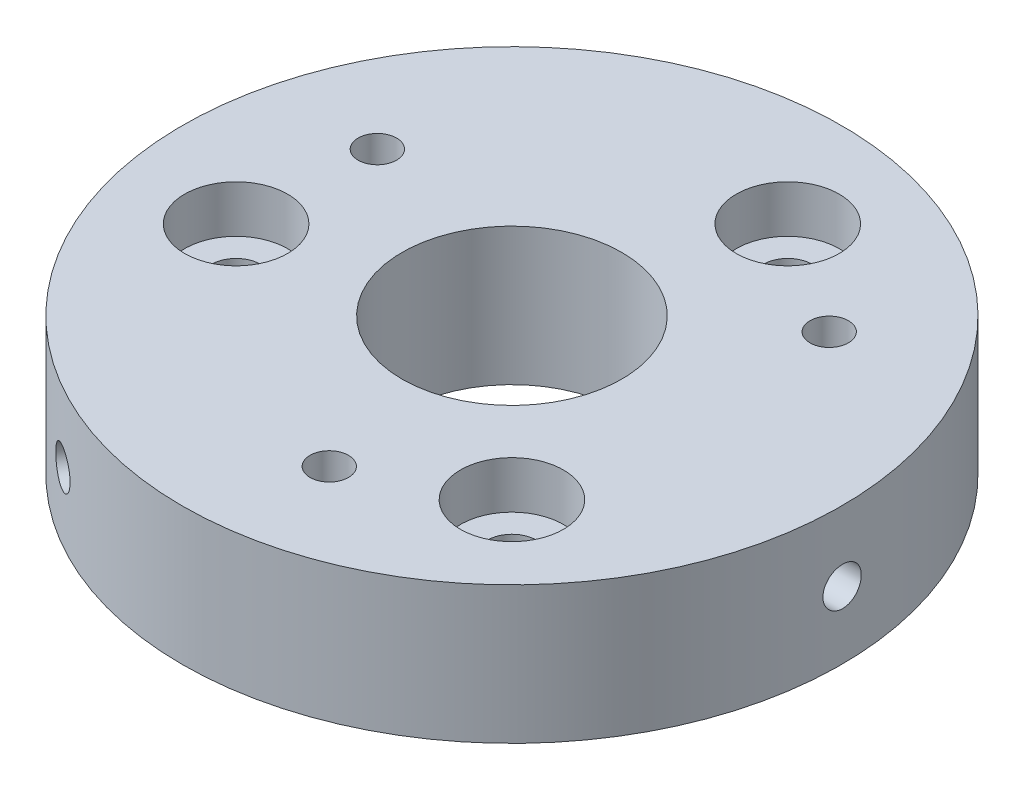
ISO-10303-21;
HEADER;
FILE_DESCRIPTION(('STEP AP214'),'2;1');
FILE_NAME('part.step','',(''),(''),'','','');
FILE_SCHEMA(('AUTOMOTIVE_DESIGN { 1 0 10303 214 1 1 1 1 }'));
ENDSEC;
DATA;
#1=APPLICATION_CONTEXT('core data for automotive mechanical design processes');
#2=APPLICATION_PROTOCOL_DEFINITION('international standard','automotive_design',2000,#1);
#3=PRODUCT_CONTEXT('',#1,'mechanical');
#4=PRODUCT('Part','Part','',(#3));
#5=PRODUCT_RELATED_PRODUCT_CATEGORY('part','',(#4));
#6=PRODUCT_DEFINITION_FORMATION('','',#4);
#7=PRODUCT_DEFINITION_CONTEXT('part definition',#1,'design');
#8=PRODUCT_DEFINITION('design','',#6,#7);
#9=PRODUCT_DEFINITION_SHAPE('','',#8);
#10=(LENGTH_UNIT() NAMED_UNIT(*) SI_UNIT(.MILLI.,.METRE.));
#11=(NAMED_UNIT(*) PLANE_ANGLE_UNIT() SI_UNIT($,.RADIAN.));
#12=(NAMED_UNIT(*) SI_UNIT($,.STERADIAN.) SOLID_ANGLE_UNIT());
#13=UNCERTAINTY_MEASURE_WITH_UNIT(LENGTH_MEASURE(1.E-05),#10,'distance_accuracy_value','');
#14=(GEOMETRIC_REPRESENTATION_CONTEXT(3) GLOBAL_UNCERTAINTY_ASSIGNED_CONTEXT((#13)) GLOBAL_UNIT_ASSIGNED_CONTEXT((#10,
#11,#12)) REPRESENTATION_CONTEXT('',''));
#15=CARTESIAN_POINT('',(0.,0.,0.));
#16=DIRECTION('',(0.,0.,1.));
#17=DIRECTION('',(1.,0.,0.));
#18=AXIS2_PLACEMENT_3D('',#15,#16,#17);
#19=CARTESIAN_POINT('',(0.,6.35,0.));
#20=DIRECTION('',(0.,-1.,0.));
#21=DIRECTION('',(0.,0.,-1.));
#22=AXIS2_PLACEMENT_3D('',#19,#20,#21);
#23=CYLINDRICAL_SURFACE('',#22,15.24);
#24=CARTESIAN_POINT('',(15.210835388447,3.10562907168175,-0.942383566053044));
#25=CARTESIAN_POINT('',(15.2108357438498,3.05573915086422,-0.942381369620589));
#26=CARTESIAN_POINT('',(15.2110982109886,3.00581413672508,-0.938170682637961));
#27=CARTESIAN_POINT('',(15.2121210827097,2.90734219854528,-0.921433529301182));
#28=CARTESIAN_POINT('',(15.2128820694043,2.85879695486656,-0.908897341170696));
#29=CARTESIAN_POINT('',(15.2148192242805,2.76452521959977,-0.875869866024178));
#30=CARTESIAN_POINT('',(15.2159951759658,2.71879727275178,-0.855382726635417));
#31=CARTESIAN_POINT('',(15.218635539739,2.63144212531057,-0.80704116645278));
#32=CARTESIAN_POINT('',(15.2200998850259,2.58981397841832,-0.779188451246291));
#33=CARTESIAN_POINT('',(15.2231624779154,2.51177273214568,-0.716865256237757));
#34=CARTESIAN_POINT('',(15.2247608799361,2.47536578145165,-0.682387083994958));
#35=CARTESIAN_POINT('',(15.2279204355405,2.40885294748971,-0.607806971227045));
#36=CARTESIAN_POINT('',(15.2294815875802,2.3787473250187,-0.567704798052651));
#37=CARTESIAN_POINT('',(15.2324037747559,2.32567350754106,-0.482980772871211));
#38=CARTESIAN_POINT('',(15.2337646698066,2.30271029645941,-0.43835579354192));
#39=CARTESIAN_POINT('',(15.2361447960645,2.26460507806796,-0.345874492886326));
#40=CARTESIAN_POINT('',(15.2371640305449,2.24946299582965,-0.298018202521815));
#41=CARTESIAN_POINT('',(15.2387590690844,2.22744663982234,-0.200490805976969));
#42=CARTESIAN_POINT('',(15.2393353814101,2.2205628842693,-0.150821848682169));
#43=CARTESIAN_POINT('',(15.239996234454,2.21522931167119,-0.0510302016138134));
#44=CARTESIAN_POINT('',(15.2400807801167,2.21677940982817,-0.000907516407309841));
#45=CARTESIAN_POINT('',(15.2397636063129,2.22826170570507,0.0983045430631114));
#46=CARTESIAN_POINT('',(15.2393624784043,2.23818370186702,0.147395100439779));
#47=CARTESIAN_POINT('',(15.2381345375052,2.26611231970426,0.243214225545538));
#48=CARTESIAN_POINT('',(15.2373077222587,2.28411898422623,0.289942780755159));
#49=CARTESIAN_POINT('',(15.2353344292366,2.32771737622591,0.379743944927557));
#50=CARTESIAN_POINT('',(15.2341877562736,2.35331373578005,0.422814300538954));
#51=CARTESIAN_POINT('',(15.2317164627169,2.41136155707889,0.504051450559688));
#52=CARTESIAN_POINT('',(15.2303918403876,2.4438130856838,0.542218197137036));
#53=CARTESIAN_POINT('',(15.2277226765829,2.51470770138043,0.612623819228835));
#54=CARTESIAN_POINT('',(15.2263781083747,2.55315964163348,0.644853779751722));
#55=CARTESIAN_POINT('',(15.2238321116513,2.63493252419421,0.702401785716356));
#56=CARTESIAN_POINT('',(15.2226306831856,2.6782534681861,0.72771982876722));
#57=CARTESIAN_POINT('',(15.2205141175537,2.76854020036475,0.770724244745043));
#58=CARTESIAN_POINT('',(15.2195989939358,2.81550616090513,0.788410256533745));
#59=CARTESIAN_POINT('',(15.2181639944575,2.91174719746249,0.815642194629128));
#60=CARTESIAN_POINT('',(15.2176441145492,2.96102224982481,0.825188204303878));
#61=CARTESIAN_POINT('',(15.2170618275163,3.06040500548103,0.835857917344753));
#62=CARTESIAN_POINT('',(15.2169987475114,3.11051137504306,0.836994008833187));
#63=CARTESIAN_POINT('',(15.217335752887,3.2102027541407,0.830843969487238));
#64=CARTESIAN_POINT('',(15.2177358361725,3.25978776603366,0.823557876750799));
#65=CARTESIAN_POINT('',(15.2189513057079,3.35699395244725,0.800780705347454));
#66=CARTESIAN_POINT('',(15.2197664038005,3.404616464825,0.785295319403622));
#67=CARTESIAN_POINT('',(15.2217152205649,3.49658708907552,0.74656515616023));
#68=CARTESIAN_POINT('',(15.2228489417532,3.54093517508458,0.723320317579108));
#69=CARTESIAN_POINT('',(15.2253019892694,3.62515499226714,0.669699738366178));
#70=CARTESIAN_POINT('',(15.2266215310992,3.66502142800395,0.639315690426118));
#71=CARTESIAN_POINT('',(15.2292877066394,3.73909296617015,0.572291714858236));
#72=CARTESIAN_POINT('',(15.230634340582,3.77329802006102,0.535651733599909));
#73=CARTESIAN_POINT('',(15.233194010107,3.8351175981552,0.457103127823221));
#74=CARTESIAN_POINT('',(15.2344068823706,3.86272411269336,0.415188193500145));
#75=CARTESIAN_POINT('',(15.2365480406411,3.91050817473892,0.327311692466773));
#76=CARTESIAN_POINT('',(15.2374763282192,3.93068576326262,0.281350148100203));
#77=CARTESIAN_POINT('',(15.2389295461299,3.96302524671264,0.18671500249684));
#78=CARTESIAN_POINT('',(15.2394547325733,3.97519223048589,0.138043144382286));
#79=CARTESIAN_POINT('',(15.2400290801221,3.99118178618579,0.0393448816022933));
#80=CARTESIAN_POINT('',(15.2400782451954,3.99500442766604,-0.0106815117690063));
#81=CARTESIAN_POINT('',(15.2396805035322,3.99419612411649,-0.110589360620635));
#82=CARTESIAN_POINT('',(15.2392343333453,3.98957772408495,-0.160470921014342));
#83=CARTESIAN_POINT('',(15.2378825899182,3.972044420156,-0.258747453865072));
#84=CARTESIAN_POINT('',(15.2369770158476,3.95912950126334,-0.307142423635046));
#85=CARTESIAN_POINT('',(15.2347940023359,3.92537251410569,-0.401074361952386));
#86=CARTESIAN_POINT('',(15.2335165633654,3.90453045587527,-0.446611334117463));
#87=CARTESIAN_POINT('',(15.2307198967076,3.85551268342642,-0.533540136784626));
#88=CARTESIAN_POINT('',(15.229200675703,3.82733717189063,-0.574932081803568));
#89=CARTESIAN_POINT('',(15.2260765288621,3.76440631906643,-0.652459625784385));
#90=CARTESIAN_POINT('',(15.2244714882328,3.72964199804947,-0.688587930797185));
#91=CARTESIAN_POINT('',(15.2213471776756,3.65453073739528,-0.754507964995057));
#92=CARTESIAN_POINT('',(15.2198279288746,3.61418243102959,-0.784298138324674));
#93=CARTESIAN_POINT('',(15.2170364576637,3.52900759887626,-0.836715841147342));
#94=CARTESIAN_POINT('',(15.2157645187489,3.48417602192189,-0.859335169093836));
#95=CARTESIAN_POINT('',(15.213608502177,3.39137672649247,-0.896699445040264));
#96=CARTESIAN_POINT('',(15.2127239690795,3.34341276717147,-0.911453643865012));
#97=CARTESIAN_POINT('',(15.2116709389508,3.26356627384235,-0.928821675839144));
#98=CARTESIAN_POINT('',(15.2113589446927,3.23220025640127,-0.933900841434112));
#99=CARTESIAN_POINT('',(15.2109410564941,3.16910391894995,-0.940682483307767));
#100=CARTESIAN_POINT('',(15.2108351623074,3.13737359937537,-0.942384963624132));
#101=CARTESIAN_POINT('',(15.210835388447,3.10562907168175,-0.942383566053044));
#102=B_SPLINE_CURVE_WITH_KNOTS('',3,(#24,#25,#26,#27,#28,#29,#30,#31,#32,#33,#34,#35,#36,#37,
#38,#39,#40,#41,#42,#43,#44,#45,#46,#47,#48,#49,#50,#51,#52,#53,#54,#55,#56,#57,#58,#59,#60,#61,
#62,#63,#64,#65,#66,#67,#68,#69,#70,#71,#72,#73,#74,#75,#76,#77,#78,#79,#80,#81,#82,#83,#84,#85,
#86,#87,#88,#89,#90,#91,#92,#93,#94,#95,#96,#97,#98,#99,#100,#101),.UNSPECIFIED.,.T.,.F.,(4,2,2,
2,2,2,2,2,2,2,2,2,2,2,2,2,2,2,2,2,2,2,2,2,2,2,2,2,2,2,2,2,2,2,2,2,2,2,4),(0.,0.149553877868915,
0.299282699176664,0.44893351894824,0.598549715576457,0.748340684221818,0.89813785113181,
1.04803931216985,1.19793933708509,1.34766708931575,1.49739333611597,1.64693739737364,
1.796482251186,1.94611856242724,2.09575633317692,2.24561700797405,2.39547773460904,
2.54534555169046,2.69521183384101,2.84485731337193,2.99450211598076,3.14404315702108,
3.2935853791145,3.4433024805025,3.59302086544113,3.7429200740914,3.89281845511146,
4.04262151900494,4.19242333422227,4.34200269636872,4.49158232886762,4.64116177202189,
4.79073708152506,4.94051772887057,5.09033510136817,5.24032321215622,5.39013451817013,
5.48529447867452,5.5804543253911),.UNSPECIFIED.);
#103=CARTESIAN_POINT('',(15.210835388447,3.10562907168175,-0.942383566053044));
#104=VERTEX_POINT('',#103);
#105=EDGE_CURVE('E11',#104,#104,#102,.T.);
#106=ORIENTED_EDGE('',*,*,#105,.T.);
#107=EDGE_LOOP('',(#106));
#108=FACE_BOUND('',#107,.T.);
#109=CARTESIAN_POINT('',(-8.42154580253449,3.10562907168175,-12.7017780761519));
#110=CARTESIAN_POINT('',(-8.42154407806955,3.05573915086422,-12.7017794821559));
#111=CARTESIAN_POINT('',(-8.41802874974463,3.00581413672508,-12.7041121288572));
#112=CARTESIAN_POINT('',(-8.40404538562846,2.90734219854528,-12.7133665384208));
#113=CARTESIAN_POINT('',(-8.39356922158816,2.85879695486656,-12.7202936662955));
#114=CARTESIAN_POINT('',(-8.36593516652651,2.76452521959977,-12.7384850292026));
#115=CARTESIAN_POINT('',(-8.34878075920765,2.71879727275178,-12.7497470029301));
#116=CARTESIAN_POINT('',(-8.30823592191751,2.63144212531057,-12.7762044051243));
#117=CARTESIAN_POINT('',(-8.28484693562772,2.58981397841832,-12.7913989229458));
#118=CARTESIAN_POINT('',(-8.23240476195011,2.51177273214568,-12.8252128036939));
#119=CARTESIAN_POINT('',(-8.20334498992213,2.47536578145165,-12.8438361465707));
#120=CARTESIAN_POINT('',(-8.14033649545022,2.40885294748971,-12.8838624583727));
#121=CARTESIAN_POINT('',(-8.10638757075408,2.3787473250187,-12.9052655422855));
#122=CARTESIAN_POINT('',(-8.03447550622392,2.32567350754106,-12.9501582432049));
#123=CARTESIAN_POINT('',(-7.99650958800675,2.30271029645941,-12.9736493025554));
#124=CARTESIAN_POINT('',(-7.91760849539293,2.26460507806796,-13.0219512026867));
#125=CARTESIAN_POINT('',(-7.87667334944655,2.24946299582965,-13.0467620308214));
#126=CARTESIAN_POINT('',(-7.79300966574353,2.22744663982234,-13.0969070729891));
#127=CARTESIAN_POINT('',(-7.75028324310958,2.2205628842693,-13.122240652751));
#128=CARTESIAN_POINT('',(-7.66419156818487,2.21522931167119,-13.1727087918094));
#129=CARTESIAN_POINT('',(-7.6208263223215,2.21677940982817,-13.1978433531044));
#130=CARTESIAN_POINT('',(-7.53474757155645,2.22826170570507,-13.2471747022681));
#131=CARTESIAN_POINT('',(-7.49203333782798,2.23818370186702,-13.2713725939973));
#132=CARTESIAN_POINT('',(-7.40843757086845,2.26611231970426,-13.3182187285372));
#133=CARTESIAN_POINT('',(-7.36755604735154,2.28411898422623,-13.3408669631344));
#134=CARTESIAN_POINT('',(-7.28879931137779,2.32771737622591,-13.3840586233344));
#135=CARTESIAN_POINT('',(-7.2509259527868,2.35331373578005,-13.4046007532243));
#136=CARTESIAN_POINT('',(-7.17933687035942,2.41136155707889,-13.4430791252343));
#137=CARTESIAN_POINT('',(-7.14562118707898,2.4438130856838,-13.4610153419354));
#138=CARTESIAN_POINT('',(-7.08331354787587,2.51470770138043,-13.4939065893195));
#139=CARTESIAN_POINT('',(-7.05472929919601,2.55315964163348,-13.5088571393556));
#140=CARTESIAN_POINT('',(-7.0036182657318,2.63493252419421,-13.5354262444975));
#141=CARTESIAN_POINT('',(-6.98109148304278,2.6782534681861,-13.5470447984508));
#142=CARTESIAN_POINT('',(-6.94279028351515,2.76854020036475,-13.5667140068337));
#143=CARTESIAN_POINT('',(-6.92701618620553,2.81550616090513,-13.5747644924273));
#144=CARTESIAN_POINT('',(-6.90271513628151,2.91174719746249,-13.5871377154724));
#145=CARTESIAN_POINT('',(-6.89418810944425,2.96102224982481,-13.5914604911023));
#146=CARTESIAN_POINT('',(-6.88465672338329,3.06040500548103,-13.5962910722599));
#147=CARTESIAN_POINT('',(-6.88364129929084,3.11051137504306,-13.5968044891174));
#148=CARTESIAN_POINT('',(-6.88913589228653,3.2102027541407,-13.594021324661));
#149=CARTESIAN_POINT('',(-6.89564587533332,3.25978776603366,-13.5907247605815));
#150=CARTESIAN_POINT('',(-6.91597921916271,3.35699395244725,-13.5803888023751));
#151=CARTESIAN_POINT('',(-6.92979750582375,3.404616464825,-13.5733520050579));
#152=CARTESIAN_POINT('',(-6.96431321946747,3.49658708907552,-13.5556746482616));
#153=CARTESIAN_POINT('',(-6.98501070077973,3.54093517508458,-13.5450340603209));
#154=CARTESIAN_POINT('',(-7.03267400830185,3.62515499226714,-13.5203481721801));
#155=CARTESIAN_POINT('',(-7.05964713660267,3.66502142800395,-13.5062989049561));
#156=CARTESIAN_POINT('',(-7.11902468987719,3.73909296617015,-13.4750958929209));
#157=CARTESIAN_POINT('',(-7.15142916141235,3.77329802006102,-13.4579421214956));
#158=CARTESIAN_POINT('',(-7.22073408420934,3.8351175981552,-13.4208845574412));
#159=CARTESIAN_POINT('',(-7.25763991826289,3.86272411269336,-13.4009774684715));
#160=CARTESIAN_POINT('',(-7.33481377968872,3.91050817473892,-13.3588935154106));
#161=CARTESIAN_POINT('',(-7.37508178849637,3.93068576326262,-13.3367166638519));
#162=CARTESIAN_POINT('',(-7.45776483763507,3.96302524671264,-13.2906576146781));
#163=CARTESIAN_POINT('',(-7.50017849643336,3.97519223048589,-13.2667765104226));
#164=CARTESIAN_POINT('',(-7.58594087308463,3.99118178618579,-13.2179247786004));
#165=CARTESIAN_POINT('',(-7.62928958314053,3.99500442766604,-13.1929541601172));
#166=CARTESIAN_POINT('',(-7.71561344745192,3.99419612411649,-13.142655781307));
#167=CARTESIAN_POINT('',(-7.75858906083982,3.98957772408495,-13.1173286063938));
#168=CARTESIAN_POINT('',(-7.84302316317084,3.972044420156,-13.0670196958212));
#169=CARTESIAN_POINT('',(-7.88448164937174,3.95912950126334,-13.0420379607861));
#170=CARTESIAN_POINT('',(-7.9647375874254,3.92537251410569,-12.9931814464694));
#171=CARTESIAN_POINT('',(-8.00353504264657,3.90453045587527,-12.9693066657867));
#172=CARTESIAN_POINT('',(-8.07741926074796,3.85551268342642,-12.9234202800815));
#173=CARTESIAN_POINT('',(-8.11250612614412,3.82733717189063,-12.9014086235881));
#174=CARTESIAN_POINT('',(-8.17808487530407,3.76440631906643,-12.8599392610683));
#175=CARTESIAN_POINT('',(-8.20857038492618,3.72964199804947,-12.8404851026028));
#176=CARTESIAN_POINT('',(-8.26409665388128,3.65453073739528,-12.8048193531921));
#177=CARTESIAN_POINT('',(-8.28913607636735,3.61418243102959,-12.7886085584709));
#178=CARTESIAN_POINT('',(-8.33313540301438,3.52900759887626,-12.759982222077));
#179=CARTESIAN_POINT('',(-8.35208834617518,3.48417602192189,-12.7475710266915));
#180=CARTESIAN_POINT('',(-8.38336875005283,3.39137672649247,-12.727021723596));
#181=CARTESIAN_POINT('',(-8.39570399449882,3.34341276717147,-12.7188785960508));
#182=CARTESIAN_POINT('',(-8.41021863633781,3.26356627384234,-12.7092826292213));
#183=CARTESIAN_POINT('',(-8.414461325644,3.23220025640127,-12.7064728514704));
#184=CARTESIAN_POINT('',(-8.42012545568669,3.16910391894995,-12.7027201287377));
#185=CARTESIAN_POINT('',(-8.42154689979671,3.13737359937537,-12.7017771815237));
#186=CARTESIAN_POINT('',(-8.42154580253449,3.10562907168175,-12.7017780761519));
#187=B_SPLINE_CURVE_WITH_KNOTS('',3,(#109,#110,#111,#112,#113,#114,#115,#116,#117,#118,#119,
#120,#121,#122,#123,#124,#125,#126,#127,#128,#129,#130,#131,#132,#133,#134,#135,#136,#137,#138,
#139,#140,#141,#142,#143,#144,#145,#146,#147,#148,#149,#150,#151,#152,#153,#154,#155,#156,#157,
#158,#159,#160,#161,#162,#163,#164,#165,#166,#167,#168,#169,#170,#171,#172,#173,#174,#175,#176,
#177,#178,#179,#180,#181,#182,#183,#184,#185,#186),.UNSPECIFIED.,.T.,.F.,(4,2,2,2,2,2,2,2,2,2,2,
2,2,2,2,2,2,2,2,2,2,2,2,2,2,2,2,2,2,2,2,2,2,2,2,2,2,2,4),(0.,0.149553877868915,
0.299282699176664,0.448933518948241,0.598549715576458,0.74834068422182,0.898137851131812,
1.04803931216985,1.19793933708509,1.34766708931575,1.49739333611597,1.64693739737364,
1.79648225118601,1.94611856242725,2.09575633317692,2.24561700797405,2.39547773460904,
2.54534555169046,2.69521183384101,2.84485731337193,2.99450211598076,3.14404315702108,
3.2935853791145,3.4433024805025,3.59302086544113,3.7429200740914,3.89281845511147,
4.04262151900494,4.19242333422226,4.34200269636872,4.49158232886762,4.64116177202189,
4.79073708152506,4.94051772887057,5.09033510136818,5.24032321215622,5.39013451817013,
5.48529447867452,5.5804543253911),.UNSPECIFIED.);
#188=CARTESIAN_POINT('',(-8.42154580253449,3.10562907168175,-12.7017780761519));
#189=VERTEX_POINT('',#188);
#190=EDGE_CURVE('E57',#189,#189,#187,.T.);
#191=ORIENTED_EDGE('',*,*,#190,.T.);
#192=EDGE_LOOP('',(#191));
#193=FACE_BOUND('',#192,.T.);
#194=CARTESIAN_POINT('',(-6.78928958591249,3.10562907168175,13.6441616422051));
#195=CARTESIAN_POINT('',(-6.78929166578016,3.05573915086422,13.6441608517766));
#196=CARTESIAN_POINT('',(-6.79306946124392,3.00581413672508,13.6422828114952));
#197=CARTESIAN_POINT('',(-6.80807569708113,2.90734219854528,13.6348000677221));
#198=CARTESIAN_POINT('',(-6.81931284781607,2.85879695486656,13.6291910074663));
#199=CARTESIAN_POINT('',(-6.8488840577539,2.76452521959977,13.6143548952269));
#200=CARTESIAN_POINT('',(-6.86721441675812,2.71879727275178,13.6051297295657));
#201=CARTESIAN_POINT('',(-6.91039961782146,2.63144212531057,13.5832455715772));
#202=CARTESIAN_POINT('',(-6.93525294939806,2.58981397841832,13.5705873741922));
#203=CARTESIAN_POINT('',(-6.99075771596525,2.51177273214568,13.5420780599318));
#204=CARTESIAN_POINT('',(-7.02141589001391,2.47536578145165,13.5262232305657));
#205=CARTESIAN_POINT('',(-7.08758394009024,2.40885294748971,13.4916694295999));
#206=CARTESIAN_POINT('',(-7.12309401682608,2.3787473250187,13.4729703403382));
#207=CARTESIAN_POINT('',(-7.19792826853192,2.32567350754106,13.4331390160763));
#208=CARTESIAN_POINT('',(-7.23725508179979,2.30271029645941,13.4120050960974));
#209=CARTESIAN_POINT('',(-7.31853630067151,2.26460507806796,13.3678256955732));
#210=CARTESIAN_POINT('',(-7.36049068109824,2.24946299582965,13.3447802333433));
#211=CARTESIAN_POINT('',(-7.4457494033408,2.22744663982234,13.2973978789661));
#212=CARTESIAN_POINT('',(-7.48905213830042,2.2205628842693,13.2730625014333));
#213=CARTESIAN_POINT('',(-7.57580466626908,2.21522931167119,13.2237389934233));
#214=CARTESIAN_POINT('',(-7.61925445779516,2.21677940982817,13.1987508695118));
#215=CARTESIAN_POINT('',(-7.70501603475642,2.22826170570507,13.1488701592051));
#216=CARTESIAN_POINT('',(-7.74732914057621,2.23818370186702,13.1239774935576));
#217=CARTESIAN_POINT('',(-7.82969696663665,2.26611231970426,13.0750045029918));
#218=CARTESIAN_POINT('',(-7.86975167490709,2.28411898422623,13.0509241823793));
#219=CARTESIAN_POINT('',(-7.94653511785877,2.32771737622591,13.0043146784069));
#220=CARTESIAN_POINT('',(-7.98326180348678,2.35331373578005,12.9817864526854));
#221=CARTESIAN_POINT('',(-8.05237959235741,2.41136155707889,12.9390276746747));
#222=CARTESIAN_POINT('',(-8.08477065330854,2.4438130856838,12.9187971447984));
#223=CARTESIAN_POINT('',(-8.14440912870693,2.51470770138043,12.8812827700908));
#224=CARTESIAN_POINT('',(-8.17164880917864,2.55315964163348,12.864003359604));
#225=CARTESIAN_POINT('',(-8.22021384591946,2.63493252419421,12.8330244587812));
#226=CARTESIAN_POINT('',(-8.24153920014274,2.6782534681861,12.8193249696836));
#227=CARTESIAN_POINT('',(-8.27772383403854,2.76854020036475,12.7959897620888));
#228=CARTESIAN_POINT('',(-8.29258280773021,2.81550616090513,12.7863542358937));
#229=CARTESIAN_POINT('',(-8.31544885817596,2.91174719746249,12.7714955208434));
#230=CARTESIAN_POINT('',(-8.32345600510491,2.96102224982481,12.7662722867985));
#231=CARTESIAN_POINT('',(-8.33240510413293,3.06040500548103,12.7604331549153));
#232=CARTESIAN_POINT('',(-8.33335744822049,3.11051137504306,12.7598104802843));
#233=CARTESIAN_POINT('',(-8.32819986060045,3.2102027541407,12.7631773551738));
#234=CARTESIAN_POINT('',(-8.32208996083907,3.25978776603366,12.7671668838308));
#235=CARTESIAN_POINT('',(-8.30297208654516,3.35699395244726,12.7796080970278));
#236=CARTESIAN_POINT('',(-8.28996889797667,3.40461646482501,12.7880566856544));
#237=CARTESIAN_POINT('',(-8.2574020010974,3.49658708907552,12.8091094921014));
#238=CARTESIAN_POINT('',(-8.23783824097341,3.54093517508458,12.8217137427419));
#239=CARTESIAN_POINT('',(-8.19262798096747,3.62515499226714,12.850648433814));
#240=CARTESIAN_POINT('',(-8.1669743944965,3.66502142800395,12.8669832145301));
#241=CARTESIAN_POINT('',(-8.11026301676219,3.73909296617015,12.9028041780628));
#242=CARTESIAN_POINT('',(-8.07920517916956,3.77329802006102,12.9222903878958));
#243=CARTESIAN_POINT('',(-8.01245992589763,3.83511759815521,12.9637814296181));
#244=CARTESIAN_POINT('',(-7.9767669641077,3.86272411269336,12.9857892749715));
#245=CARTESIAN_POINT('',(-7.90173426095234,3.91050817473892,13.0315818229439));
#246=CARTESIAN_POINT('',(-7.86239453972276,3.93068576326262,13.0553665157518));
#247=CARTESIAN_POINT('',(-7.78116470849476,3.96302524671264,13.1039426121814));
#248=CARTESIAN_POINT('',(-7.73927623613986,3.97519223048589,13.1287333660404));
#249=CARTESIAN_POINT('',(-7.6540882070374,3.99118178618579,13.1785798969983));
#250=CARTESIAN_POINT('',(-7.61078866205478,3.99500442766604,13.2036356718863));
#251=CARTESIAN_POINT('',(-7.52406705608023,3.99419612411649,13.2532451419277));
#252=CARTESIAN_POINT('',(-7.48064527250542,3.98957772408495,13.2777995274083));
#253=CARTESIAN_POINT('',(-7.39485942674727,3.972044420156,13.3257671496864));
#254=CARTESIAN_POINT('',(-7.35249536647581,3.95912950126334,13.3491803844212));
#255=CARTESIAN_POINT('',(-7.27005641491041,3.92537251410569,13.3942558084219));
#256=CARTESIAN_POINT('',(-7.22998152071881,3.90453045587526,13.4159179999043));
#257=CARTESIAN_POINT('',(-7.15330063595956,3.85551268342642,13.4569604168662));
#258=CARTESIAN_POINT('',(-7.11669454955881,3.82733717189063,13.4763407053918));
#259=CARTESIAN_POINT('',(-7.04799165355795,3.76440631906643,13.5123988868528));
#260=CARTESIAN_POINT('',(-7.01590110330654,3.72964199804947,13.5290730334001));
#261=CARTESIAN_POINT('',(-6.95725052379425,3.65453073739528,13.5593273181872));
#262=CARTESIAN_POINT('',(-6.93069185250715,3.61418243102959,13.5729066967957));
#263=CARTESIAN_POINT('',(-6.88390105464927,3.52900759887626,13.5966980632245));
#264=CARTESIAN_POINT('',(-6.86367617257368,3.48417602192189,13.6069061957855));
#265=CARTESIAN_POINT('',(-6.83023975212409,3.39137672649247,13.6237211686364));
#266=CARTESIAN_POINT('',(-6.81701997458065,3.34341276717147,13.6303322399159));
#267=CARTESIAN_POINT('',(-6.80145230261296,3.26356627384235,13.6381043050605));
#268=CARTESIAN_POINT('',(-6.7968976190486,3.23220025640127,13.6403736929046));
#269=CARTESIAN_POINT('',(-6.79081560080739,3.16910391894995,13.6434026120456));
#270=CARTESIAN_POINT('',(-6.78928826251058,3.13737359937537,13.6441621451479));
#271=CARTESIAN_POINT('',(-6.78928958591249,3.10562907168175,13.6441616422051));
#272=B_SPLINE_CURVE_WITH_KNOTS('',3,(#194,#195,#196,#197,#198,#199,#200,#201,#202,#203,#204,
#205,#206,#207,#208,#209,#210,#211,#212,#213,#214,#215,#216,#217,#218,#219,#220,#221,#222,#223,
#224,#225,#226,#227,#228,#229,#230,#231,#232,#233,#234,#235,#236,#237,#238,#239,#240,#241,#242,
#243,#244,#245,#246,#247,#248,#249,#250,#251,#252,#253,#254,#255,#256,#257,#258,#259,#260,#261,
#262,#263,#264,#265,#266,#267,#268,#269,#270,#271),.UNSPECIFIED.,.T.,.F.,(4,2,2,2,2,2,2,2,2,2,2,
2,2,2,2,2,2,2,2,2,2,2,2,2,2,2,2,2,2,2,2,2,2,2,2,2,2,2,4),(0.,0.149553877868915,
0.299282699176665,0.448933518948241,0.598549715576458,0.74834068422182,0.898137851131812,
1.04803931216985,1.19793933708509,1.34766708931575,1.49739333611597,1.64693739737364,
1.796482251186,1.94611856242724,2.09575633317692,2.24561700797405,2.39547773460904,
2.54534555169046,2.69521183384101,2.84485731337193,2.99450211598077,3.14404315702108,
3.2935853791145,3.44330248050251,3.59302086544113,3.74292007409141,3.89281845511147,
4.04262151900494,4.19242333422227,4.34200269636873,4.49158232886762,4.64116177202189,
4.79073708152506,4.94051772887058,5.09033510136818,5.24032321215622,5.39013451817013,
5.48529447867452,5.58045432539111),.UNSPECIFIED.);
#273=CARTESIAN_POINT('',(-6.78928958591249,3.10562907168175,13.6441616422051));
#274=VERTEX_POINT('',#273);
#275=EDGE_CURVE('E157',#274,#274,#272,.T.);
#276=ORIENTED_EDGE('',*,*,#275,.T.);
#277=EDGE_LOOP('',(#276));
#278=FACE_BOUND('',#277,.T.);
#279=CARTESIAN_POINT('',(0.,6.35,0.));
#280=DIRECTION('',(0.,1.,0.));
#281=DIRECTION('',(0.,0.,1.));
#282=AXIS2_PLACEMENT_3D('',#279,#280,#281);
#283=CIRCLE('',#282,15.24);
#284=CARTESIAN_POINT('',(0.,6.35,15.24));
#285=VERTEX_POINT('',#284);
#286=EDGE_CURVE('E154',#285,#285,#283,.T.);
#287=ORIENTED_EDGE('',*,*,#286,.F.);
#288=EDGE_LOOP('',(#287));
#289=FACE_BOUND('',#288,.T.);
#290=CARTESIAN_POINT('',(0.,0.,0.));
#291=DIRECTION('',(0.,1.,0.));
#292=DIRECTION('',(0.,0.,1.));
#293=AXIS2_PLACEMENT_3D('',#290,#291,#292);
#294=CIRCLE('',#293,15.24);
#295=CARTESIAN_POINT('',(0.,0.,15.24));
#296=VERTEX_POINT('',#295);
#297=EDGE_CURVE('E153',#296,#296,#294,.T.);
#298=ORIENTED_EDGE('',*,*,#297,.T.);
#299=EDGE_LOOP('',(#298));
#300=FACE_BOUND('',#299,.T.);
#301=ADVANCED_FACE('F45',(#108,#193,#278,#289,#300),#23,.T.);
#302=CARTESIAN_POINT('',(0.,6.35,0.));
#303=DIRECTION('',(0.,1.,0.));
#304=DIRECTION('',(0.,0.,1.));
#305=AXIS2_PLACEMENT_3D('',#302,#303,#304);
#306=PLANE('',#305);
#307=CARTESIAN_POINT('',(0.,6.35,0.));
#308=DIRECTION('',(0.,1.,0.));
#309=DIRECTION('',(0.,0.,1.));
#310=AXIS2_PLACEMENT_3D('',#307,#308,#309);
#311=CIRCLE('',#310,5.08);
#312=CARTESIAN_POINT('',(0.,6.35,5.08));
#313=VERTEX_POINT('',#312);
#314=EDGE_CURVE('E93',#313,#313,#311,.T.);
#315=ORIENTED_EDGE('',*,*,#314,.F.);
#316=EDGE_LOOP('',(#315));
#317=FACE_BOUND('',#316,.T.);
#318=CARTESIAN_POINT('',(-9.78595895286442,6.35,-3.56179777259358));
#319=DIRECTION('',(0.,1.,0.));
#320=DIRECTION('',(0.,0.,1.));
#321=AXIS2_PLACEMENT_3D('',#318,#319,#320);
#322=CIRCLE('',#321,0.888999999999999);
#323=CARTESIAN_POINT('',(-9.78595895286442,6.35,-2.67279777259359));
#324=VERTEX_POINT('',#323);
#325=EDGE_CURVE('E99',#324,#324,#322,.T.);
#326=ORIENTED_EDGE('',*,*,#325,.F.);
#327=EDGE_LOOP('',(#326));
#328=FACE_BOUND('',#327,.T.);
#329=CARTESIAN_POINT('',(1.80837212222339,6.35,10.2557879398691));
#330=DIRECTION('',(0.,1.,0.));
#331=DIRECTION('',(0.,0.,1.));
#332=AXIS2_PLACEMENT_3D('',#329,#330,#331);
#333=CIRCLE('',#332,0.889);
#334=CARTESIAN_POINT('',(1.80837212222339,6.35,11.1447879398691));
#335=VERTEX_POINT('',#334);
#336=EDGE_CURVE('E105',#335,#335,#333,.T.);
#337=ORIENTED_EDGE('',*,*,#336,.F.);
#338=EDGE_LOOP('',(#337));
#339=FACE_BOUND('',#338,.T.);
#340=CARTESIAN_POINT('',(7.97758683064102,6.35,-6.69399016727564));
#341=DIRECTION('',(0.,1.,0.));
#342=DIRECTION('',(0.,0.,1.));
#343=AXIS2_PLACEMENT_3D('',#340,#341,#342);
#344=CIRCLE('',#343,0.888999999999999);
#345=CARTESIAN_POINT('',(7.97758683064102,6.35,-5.80499016727564));
#346=VERTEX_POINT('',#345);
#347=EDGE_CURVE('E111',#346,#346,#344,.T.);
#348=ORIENTED_EDGE('',*,*,#347,.F.);
#349=EDGE_LOOP('',(#348));
#350=FACE_BOUND('',#349,.T.);
#351=CARTESIAN_POINT('',(-10.0591515549743,6.35,2.69534153569774));
#352=DIRECTION('',(0.,1.,0.));
#353=DIRECTION('',(0.,0.,1.));
#354=AXIS2_PLACEMENT_3D('',#351,#352,#353);
#355=CIRCLE('',#354,2.38125);
#356=CARTESIAN_POINT('',(-10.0591515549743,6.35,5.07659153569775));
#357=VERTEX_POINT('',#356);
#358=EDGE_CURVE('E117',#357,#357,#355,.T.);
#359=ORIENTED_EDGE('',*,*,#358,.F.);
#360=EDGE_LOOP('',(#359));
#361=FACE_BOUND('',#360,.T.);
#362=CARTESIAN_POINT('',(2.6953415356976,6.35,-10.0591515549744));
#363=DIRECTION('',(0.,1.,0.));
#364=DIRECTION('',(0.,0.,1.));
#365=AXIS2_PLACEMENT_3D('',#362,#363,#364);
#366=CIRCLE('',#365,2.38125);
#367=CARTESIAN_POINT('',(2.6953415356976,6.35,-7.67790155497437));
#368=VERTEX_POINT('',#367);
#369=EDGE_CURVE('E129',#368,#368,#366,.T.);
#370=ORIENTED_EDGE('',*,*,#369,.F.);
#371=EDGE_LOOP('',(#370));
#372=FACE_BOUND('',#371,.T.);
#373=CARTESIAN_POINT('',(7.36381001927671,6.35,7.36381001927671));
#374=DIRECTION('',(0.,1.,0.));
#375=DIRECTION('',(0.,0.,1.));
#376=AXIS2_PLACEMENT_3D('',#373,#374,#375);
#377=CIRCLE('',#376,2.38125);
#378=CARTESIAN_POINT('',(7.36381001927671,6.35,9.74506001927671));
#379=VERTEX_POINT('',#378);
#380=EDGE_CURVE('E141',#379,#379,#377,.T.);
#381=ORIENTED_EDGE('',*,*,#380,.F.);
#382=EDGE_LOOP('',(#381));
#383=FACE_BOUND('',#382,.T.);
#384=ORIENTED_EDGE('',*,*,#286,.T.);
#385=EDGE_LOOP('',(#384));
#386=FACE_BOUND('',#385,.T.);
#387=ADVANCED_FACE('F240',(#317,#328,#339,#350,#361,#372,#383,#386),#306,.T.);
#388=CARTESIAN_POINT('',(0.,0.,0.));
#389=DIRECTION('',(0.,1.,0.));
#390=DIRECTION('',(0.,0.,1.));
#391=AXIS2_PLACEMENT_3D('',#388,#389,#390);
#392=PLANE('',#391);
#393=CARTESIAN_POINT('',(0.,0.,0.));
#394=DIRECTION('',(0.,1.,0.));
#395=DIRECTION('',(0.,0.,1.));
#396=AXIS2_PLACEMENT_3D('',#393,#394,#395);
#397=CIRCLE('',#396,5.08);
#398=CARTESIAN_POINT('',(0.,0.,5.08));
#399=VERTEX_POINT('',#398);
#400=EDGE_CURVE('E87',#399,#399,#397,.T.);
#401=ORIENTED_EDGE('',*,*,#400,.T.);
#402=EDGE_LOOP('',(#401));
#403=FACE_BOUND('',#402,.T.);
#404=CARTESIAN_POINT('',(-10.0591515549743,0.,2.69534153569774));
#405=DIRECTION('',(0.,1.,0.));
#406=DIRECTION('',(0.,0.,1.));
#407=AXIS2_PLACEMENT_3D('',#404,#405,#406);
#408=CIRCLE('',#407,1.1303);
#409=CARTESIAN_POINT('',(-10.0591515549743,0.,3.82564153569774));
#410=VERTEX_POINT('',#409);
#411=EDGE_CURVE('E126',#410,#410,#408,.T.);
#412=ORIENTED_EDGE('',*,*,#411,.T.);
#413=EDGE_LOOP('',(#412));
#414=FACE_BOUND('',#413,.T.);
#415=CARTESIAN_POINT('',(2.6953415356976,0.,-10.0591515549744));
#416=DIRECTION('',(0.,1.,0.));
#417=DIRECTION('',(0.,0.,1.));
#418=AXIS2_PLACEMENT_3D('',#415,#416,#417);
#419=CIRCLE('',#418,1.1303);
#420=CARTESIAN_POINT('',(2.6953415356976,0.,-8.92885155497437));
#421=VERTEX_POINT('',#420);
#422=EDGE_CURVE('E138',#421,#421,#419,.T.);
#423=ORIENTED_EDGE('',*,*,#422,.T.);
#424=EDGE_LOOP('',(#423));
#425=FACE_BOUND('',#424,.T.);
#426=CARTESIAN_POINT('',(7.36381001927671,0.,7.36381001927671));
#427=DIRECTION('',(0.,1.,0.));
#428=DIRECTION('',(0.,0.,1.));
#429=AXIS2_PLACEMENT_3D('',#426,#427,#428);
#430=CIRCLE('',#429,1.1303);
#431=CARTESIAN_POINT('',(7.36381001927671,0.,8.4941100192767));
#432=VERTEX_POINT('',#431);
#433=EDGE_CURVE('E150',#432,#432,#430,.T.);
#434=ORIENTED_EDGE('',*,*,#433,.T.);
#435=EDGE_LOOP('',(#434));
#436=FACE_BOUND('',#435,.T.);
#437=ORIENTED_EDGE('',*,*,#297,.F.);
#438=EDGE_LOOP('',(#437));
#439=FACE_BOUND('',#438,.T.);
#440=ADVANCED_FACE('F238',(#403,#414,#425,#436,#439),#392,.F.);
#441=CARTESIAN_POINT('',(7.36381001927671,6.35,7.36381001927671));
#442=DIRECTION('',(0.,1.,0.));
#443=DIRECTION('',(0.,0.,1.));
#444=AXIS2_PLACEMENT_3D('',#441,#442,#443);
#445=CYLINDRICAL_SURFACE('',#444,1.1303);
#446=ORIENTED_EDGE('',*,*,#433,.F.);
#447=EDGE_LOOP('',(#446));
#448=FACE_BOUND('',#447,.T.);
#449=CARTESIAN_POINT('',(7.36381001927671,4.1656,7.36381001927671));
#450=DIRECTION('',(0.,1.,0.));
#451=DIRECTION('',(0.,0.,1.));
#452=AXIS2_PLACEMENT_3D('',#449,#450,#451);
#453=CIRCLE('',#452,1.1303);
#454=CARTESIAN_POINT('',(7.36381001927671,4.1656,8.4941100192767));
#455=VERTEX_POINT('',#454);
#456=EDGE_CURVE('E147',#455,#455,#453,.T.);
#457=ORIENTED_EDGE('',*,*,#456,.T.);
#458=EDGE_LOOP('',(#457));
#459=FACE_BOUND('',#458,.T.);
#460=ADVANCED_FACE('F234',(#448,#459),#445,.F.);
#461=CARTESIAN_POINT('',(8.4941100192767,4.1656,7.36381001927671));
#462=DIRECTION('',(0.,-1.,0.));
#463=DIRECTION('',(0.,0.,-1.));
#464=AXIS2_PLACEMENT_3D('',#461,#462,#463);
#465=PLANE('',#464);
#466=ORIENTED_EDGE('',*,*,#456,.F.);
#467=EDGE_LOOP('',(#466));
#468=FACE_BOUND('',#467,.T.);
#469=CARTESIAN_POINT('',(7.36381001927671,4.1656,7.36381001927671));
#470=DIRECTION('',(0.,1.,0.));
#471=DIRECTION('',(0.,0.,1.));
#472=AXIS2_PLACEMENT_3D('',#469,#470,#471);
#473=CIRCLE('',#472,2.38125);
#474=CARTESIAN_POINT('',(7.36381001927671,4.1656,9.74506001927671));
#475=VERTEX_POINT('',#474);
#476=EDGE_CURVE('E144',#475,#475,#473,.T.);
#477=ORIENTED_EDGE('',*,*,#476,.T.);
#478=EDGE_LOOP('',(#477));
#479=FACE_BOUND('',#478,.T.);
#480=ADVANCED_FACE('F230',(#468,#479),#465,.F.);
#481=CARTESIAN_POINT('',(7.36381001927671,6.35,7.36381001927671));
#482=DIRECTION('',(0.,1.,0.));
#483=DIRECTION('',(0.,0.,1.));
#484=AXIS2_PLACEMENT_3D('',#481,#482,#483);
#485=CYLINDRICAL_SURFACE('',#484,2.38125);
#486=ORIENTED_EDGE('',*,*,#476,.F.);
#487=EDGE_LOOP('',(#486));
#488=FACE_BOUND('',#487,.T.);
#489=ORIENTED_EDGE('',*,*,#380,.T.);
#490=EDGE_LOOP('',(#489));
#491=FACE_BOUND('',#490,.T.);
#492=ADVANCED_FACE('F226',(#488,#491),#485,.F.);
#493=CARTESIAN_POINT('',(2.6953415356976,6.35,-10.0591515549744));
#494=DIRECTION('',(0.,1.,0.));
#495=DIRECTION('',(0.,0.,1.));
#496=AXIS2_PLACEMENT_3D('',#493,#494,#495);
#497=CYLINDRICAL_SURFACE('',#496,1.1303);
#498=ORIENTED_EDGE('',*,*,#422,.F.);
#499=EDGE_LOOP('',(#498));
#500=FACE_BOUND('',#499,.T.);
#501=CARTESIAN_POINT('',(2.6953415356976,4.1656,-10.0591515549744));
#502=DIRECTION('',(0.,1.,0.));
#503=DIRECTION('',(0.,0.,1.));
#504=AXIS2_PLACEMENT_3D('',#501,#502,#503);
#505=CIRCLE('',#504,1.1303);
#506=CARTESIAN_POINT('',(2.6953415356976,4.1656,-8.92885155497437));
#507=VERTEX_POINT('',#506);
#508=EDGE_CURVE('E135',#507,#507,#505,.T.);
#509=ORIENTED_EDGE('',*,*,#508,.T.);
#510=EDGE_LOOP('',(#509));
#511=FACE_BOUND('',#510,.T.);
#512=ADVANCED_FACE('F222',(#500,#511),#497,.F.);
#513=CARTESIAN_POINT('',(3.8256415356976,4.1656,-10.0591515549744));
#514=DIRECTION('',(0.,-1.,0.));
#515=DIRECTION('',(0.,0.,-1.));
#516=AXIS2_PLACEMENT_3D('',#513,#514,#515);
#517=PLANE('',#516);
#518=ORIENTED_EDGE('',*,*,#508,.F.);
#519=EDGE_LOOP('',(#518));
#520=FACE_BOUND('',#519,.T.);
#521=CARTESIAN_POINT('',(2.6953415356976,4.1656,-10.0591515549744));
#522=DIRECTION('',(0.,1.,0.));
#523=DIRECTION('',(0.,0.,1.));
#524=AXIS2_PLACEMENT_3D('',#521,#522,#523);
#525=CIRCLE('',#524,2.38125);
#526=CARTESIAN_POINT('',(2.6953415356976,4.1656,-7.67790155497437));
#527=VERTEX_POINT('',#526);
#528=EDGE_CURVE('E132',#527,#527,#525,.T.);
#529=ORIENTED_EDGE('',*,*,#528,.T.);
#530=EDGE_LOOP('',(#529));
#531=FACE_BOUND('',#530,.T.);
#532=ADVANCED_FACE('F218',(#520,#531),#517,.F.);
#533=CARTESIAN_POINT('',(2.6953415356976,6.35,-10.0591515549744));
#534=DIRECTION('',(0.,1.,0.));
#535=DIRECTION('',(0.,0.,1.));
#536=AXIS2_PLACEMENT_3D('',#533,#534,#535);
#537=CYLINDRICAL_SURFACE('',#536,2.38125);
#538=ORIENTED_EDGE('',*,*,#528,.F.);
#539=EDGE_LOOP('',(#538));
#540=FACE_BOUND('',#539,.T.);
#541=ORIENTED_EDGE('',*,*,#369,.T.);
#542=EDGE_LOOP('',(#541));
#543=FACE_BOUND('',#542,.T.);
#544=ADVANCED_FACE('F214',(#540,#543),#537,.F.);
#545=CARTESIAN_POINT('',(-10.0591515549743,6.35,2.69534153569774));
#546=DIRECTION('',(0.,1.,0.));
#547=DIRECTION('',(0.,0.,1.));
#548=AXIS2_PLACEMENT_3D('',#545,#546,#547);
#549=CYLINDRICAL_SURFACE('',#548,1.1303);
#550=ORIENTED_EDGE('',*,*,#411,.F.);
#551=EDGE_LOOP('',(#550));
#552=FACE_BOUND('',#551,.T.);
#553=CARTESIAN_POINT('',(-10.0591515549743,4.1656,2.69534153569774));
#554=DIRECTION('',(0.,1.,0.));
#555=DIRECTION('',(0.,0.,1.));
#556=AXIS2_PLACEMENT_3D('',#553,#554,#555);
#557=CIRCLE('',#556,1.1303);
#558=CARTESIAN_POINT('',(-10.0591515549743,4.1656,3.82564153569774));
#559=VERTEX_POINT('',#558);
#560=EDGE_CURVE('E123',#559,#559,#557,.T.);
#561=ORIENTED_EDGE('',*,*,#560,.T.);
#562=EDGE_LOOP('',(#561));
#563=FACE_BOUND('',#562,.T.);
#564=ADVANCED_FACE('F210',(#552,#563),#549,.F.);
#565=CARTESIAN_POINT('',(-8.92885155497433,4.1656,2.69534153569774));
#566=DIRECTION('',(0.,-1.,0.));
#567=DIRECTION('',(0.,0.,-1.));
#568=AXIS2_PLACEMENT_3D('',#565,#566,#567);
#569=PLANE('',#568);
#570=ORIENTED_EDGE('',*,*,#560,.F.);
#571=EDGE_LOOP('',(#570));
#572=FACE_BOUND('',#571,.T.);
#573=CARTESIAN_POINT('',(-10.0591515549743,4.1656,2.69534153569774));
#574=DIRECTION('',(0.,1.,0.));
#575=DIRECTION('',(0.,0.,1.));
#576=AXIS2_PLACEMENT_3D('',#573,#574,#575);
#577=CIRCLE('',#576,2.38125);
#578=CARTESIAN_POINT('',(-10.0591515549743,4.1656,5.07659153569775));
#579=VERTEX_POINT('',#578);
#580=EDGE_CURVE('E120',#579,#579,#577,.T.);
#581=ORIENTED_EDGE('',*,*,#580,.T.);
#582=EDGE_LOOP('',(#581));
#583=FACE_BOUND('',#582,.T.);
#584=ADVANCED_FACE('F206',(#572,#583),#569,.F.);
#585=CARTESIAN_POINT('',(-10.0591515549743,6.35,2.69534153569774));
#586=DIRECTION('',(0.,1.,0.));
#587=DIRECTION('',(0.,0.,1.));
#588=AXIS2_PLACEMENT_3D('',#585,#586,#587);
#589=CYLINDRICAL_SURFACE('',#588,2.38125);
#590=ORIENTED_EDGE('',*,*,#580,.F.);
#591=EDGE_LOOP('',(#590));
#592=FACE_BOUND('',#591,.T.);
#593=ORIENTED_EDGE('',*,*,#358,.T.);
#594=EDGE_LOOP('',(#593));
#595=FACE_BOUND('',#594,.T.);
#596=ADVANCED_FACE('F203',(#592,#595),#589,.F.);
#597=CARTESIAN_POINT('',(7.97758683064102,2.286,-6.69399016727564));
#598=DIRECTION('',(0.,1.,0.));
#599=DIRECTION('',(0.,0.,1.));
#600=AXIS2_PLACEMENT_3D('',#597,#598,#599);
#601=CONICAL_SURFACE('',#600,0.888999999999999,1.02974425867665);
#602=CARTESIAN_POINT('',(7.97758683064102,1.7518349096845,-6.69399016727564));
#603=VERTEX_POINT('',#602);
#604=VERTEX_LOOP('',#603);
#605=FACE_BOUND('',#604,.T.);
#606=CARTESIAN_POINT('',(7.97758683064102,2.286,-6.69399016727564));
#607=DIRECTION('',(0.,1.,0.));
#608=DIRECTION('',(0.,0.,1.));
#609=AXIS2_PLACEMENT_3D('',#606,#607,#608);
#610=CIRCLE('',#609,0.888999999999999);
#611=CARTESIAN_POINT('',(7.97758683064102,2.286,-5.80499016727564));
#612=VERTEX_POINT('',#611);
#613=EDGE_CURVE('E114',#612,#612,#610,.T.);
#614=ORIENTED_EDGE('',*,*,#613,.T.);
#615=EDGE_LOOP('',(#614));
#616=FACE_BOUND('',#615,.T.);
#617=ADVANCED_FACE('F199',(#605,#616),#601,.F.);
#618=CARTESIAN_POINT('',(7.97758683064102,6.35,-6.69399016727564));
#619=DIRECTION('',(0.,1.,0.));
#620=DIRECTION('',(0.,0.,1.));
#621=AXIS2_PLACEMENT_3D('',#618,#619,#620);
#622=CYLINDRICAL_SURFACE('',#621,0.888999999999999);
#623=ORIENTED_EDGE('',*,*,#613,.F.);
#624=EDGE_LOOP('',(#623));
#625=FACE_BOUND('',#624,.T.);
#626=ORIENTED_EDGE('',*,*,#347,.T.);
#627=EDGE_LOOP('',(#626));
#628=FACE_BOUND('',#627,.T.);
#629=ADVANCED_FACE('F196',(#625,#628),#622,.F.);
#630=CARTESIAN_POINT('',(1.80837212222339,2.286,10.2557879398691));
#631=DIRECTION('',(0.,1.,0.));
#632=DIRECTION('',(0.,0.,1.));
#633=AXIS2_PLACEMENT_3D('',#630,#631,#632);
#634=CONICAL_SURFACE('',#633,0.888999999999999,1.02974425867665);
#635=CARTESIAN_POINT('',(1.80837212222339,1.7518349096845,10.2557879398691));
#636=VERTEX_POINT('',#635);
#637=VERTEX_LOOP('',#636);
#638=FACE_BOUND('',#637,.T.);
#639=CARTESIAN_POINT('',(1.80837212222339,2.286,10.2557879398691));
#640=DIRECTION('',(0.,1.,0.));
#641=DIRECTION('',(0.,0.,1.));
#642=AXIS2_PLACEMENT_3D('',#639,#640,#641);
#643=CIRCLE('',#642,0.888999999999999);
#644=CARTESIAN_POINT('',(1.80837212222339,2.286,11.1447879398691));
#645=VERTEX_POINT('',#644);
#646=EDGE_CURVE('E108',#645,#645,#643,.T.);
#647=ORIENTED_EDGE('',*,*,#646,.T.);
#648=EDGE_LOOP('',(#647));
#649=FACE_BOUND('',#648,.T.);
#650=ADVANCED_FACE('F192',(#638,#649),#634,.F.);
#651=CARTESIAN_POINT('',(1.80837212222339,6.35,10.2557879398691));
#652=DIRECTION('',(0.,1.,0.));
#653=DIRECTION('',(0.,0.,1.));
#654=AXIS2_PLACEMENT_3D('',#651,#652,#653);
#655=CYLINDRICAL_SURFACE('',#654,0.888999999999999);
#656=ORIENTED_EDGE('',*,*,#646,.F.);
#657=EDGE_LOOP('',(#656));
#658=FACE_BOUND('',#657,.T.);
#659=ORIENTED_EDGE('',*,*,#336,.T.);
#660=EDGE_LOOP('',(#659));
#661=FACE_BOUND('',#660,.T.);
#662=ADVANCED_FACE('F188',(#658,#661),#655,.F.);
#663=CARTESIAN_POINT('',(-9.78595895286442,2.286,-3.56179777259358));
#664=DIRECTION('',(0.,1.,0.));
#665=DIRECTION('',(0.,0.,1.));
#666=AXIS2_PLACEMENT_3D('',#663,#664,#665);
#667=CONICAL_SURFACE('',#666,0.888999999999999,1.02974425867665);
#668=CARTESIAN_POINT('',(-9.78595895286442,1.7518349096845,-3.56179777259358));
#669=VERTEX_POINT('',#668);
#670=VERTEX_LOOP('',#669);
#671=FACE_BOUND('',#670,.T.);
#672=CARTESIAN_POINT('',(-9.78595895286442,2.286,-3.56179777259358));
#673=DIRECTION('',(0.,1.,0.));
#674=DIRECTION('',(0.,0.,1.));
#675=AXIS2_PLACEMENT_3D('',#672,#673,#674);
#676=CIRCLE('',#675,0.888999999999999);
#677=CARTESIAN_POINT('',(-9.78595895286442,2.286,-2.67279777259359));
#678=VERTEX_POINT('',#677);
#679=EDGE_CURVE('E102',#678,#678,#676,.T.);
#680=ORIENTED_EDGE('',*,*,#679,.T.);
#681=EDGE_LOOP('',(#680));
#682=FACE_BOUND('',#681,.T.);
#683=ADVANCED_FACE('F184',(#671,#682),#667,.F.);
#684=CARTESIAN_POINT('',(-9.78595895286442,6.35,-3.56179777259358));
#685=DIRECTION('',(0.,1.,0.));
#686=DIRECTION('',(0.,0.,1.));
#687=AXIS2_PLACEMENT_3D('',#684,#685,#686);
#688=CYLINDRICAL_SURFACE('',#687,0.888999999999999);
#689=ORIENTED_EDGE('',*,*,#679,.F.);
#690=EDGE_LOOP('',(#689));
#691=FACE_BOUND('',#690,.T.);
#692=ORIENTED_EDGE('',*,*,#325,.T.);
#693=EDGE_LOOP('',(#692));
#694=FACE_BOUND('',#693,.T.);
#695=ADVANCED_FACE('F175',(#691,#694),#688,.F.);
#696=CARTESIAN_POINT('',(-7.57363794986149,3.10562907168175,13.2248859429644));
#697=DIRECTION('',(-0.49695787072582,0.,0.867774668173518));
#698=DIRECTION('',(0.867774668173518,0.,0.49695787072582));
#699=AXIS2_PLACEMENT_3D('',#696,#697,#698);
#700=CYLINDRICAL_SURFACE('',#699,0.888999999999998);
#701=CARTESIAN_POINT('',(-4.41795547075254,3.10562907168175,7.71451680006258));
#702=DIRECTION('',(-0.49695787072582,0.,0.867774668173518));
#703=DIRECTION('',(0.867774668173518,0.,0.49695787072582));
#704=AXIS2_PLACEMENT_3D('',#701,#702,#703);
#705=CIRCLE('',#704,0.888999999999998);
#706=CARTESIAN_POINT('',(-3.64650379074628,3.10562907168175,8.15631234713783));
#707=VERTEX_POINT('',#706);
#708=EDGE_CURVE('E90',#707,#707,#705,.T.);
#709=ORIENTED_EDGE('',*,*,#708,.F.);
#710=EDGE_LOOP('',(#709));
#711=FACE_BOUND('',#710,.T.);
#712=ORIENTED_EDGE('',*,*,#275,.F.);
#713=EDGE_LOOP('',(#712));
#714=FACE_BOUND('',#713,.T.);
#715=ADVANCED_FACE('F169',(#711,#714),#700,.F.);
#716=CARTESIAN_POINT('',(-4.41795547075254,3.10562907168175,7.71451680006258));
#717=DIRECTION('',(-0.49695787072582,0.,0.867774668173518));
#718=DIRECTION('',(0.867774668173518,0.,0.49695787072582));
#719=AXIS2_PLACEMENT_3D('',#716,#717,#718);
#720=CONICAL_SURFACE('',#719,0.888999999999998,0.872664625997163);
#721=CARTESIAN_POINT('',(-4.04724499014593,3.10562907168174,7.06719197989823));
#722=VERTEX_POINT('',#721);
#723=VERTEX_LOOP('',#722);
#724=FACE_BOUND('',#723,.T.);
#725=ORIENTED_EDGE('',*,*,#708,.T.);
#726=EDGE_LOOP('',(#725));
#727=FACE_BOUND('',#726,.T.);
#728=ADVANCED_FACE('F174',(#724,#727),#720,.F.);
#729=CARTESIAN_POINT('',(-7.6662682138281,3.10562907168175,-13.1714058351282));
#730=DIRECTION('',(-0.503035972035965,0.,-0.864265474745944));
#731=DIRECTION('',(-0.864265474745944,0.,0.503035972035965));
#732=AXIS2_PLACEMENT_3D('',#729,#730,#731);
#733=CYLINDRICAL_SURFACE('',#732,0.888999999999998);
#734=CARTESIAN_POINT('',(-4.47198979139973,3.10562907168175,-7.68332007049145));
#735=DIRECTION('',(-0.503035972035965,0.,-0.864265474745944));
#736=DIRECTION('',(-0.864265474745944,0.,0.503035972035965));
#737=AXIS2_PLACEMENT_3D('',#734,#735,#736);
#738=CIRCLE('',#737,0.888999999999998);
#739=CARTESIAN_POINT('',(-5.24032179844887,3.10562907168175,-7.23612109135148));
#740=VERTEX_POINT('',#739);
#741=EDGE_CURVE('E86',#740,#740,#738,.T.);
#742=ORIENTED_EDGE('',*,*,#741,.F.);
#743=EDGE_LOOP('',(#742));
#744=FACE_BOUND('',#743,.T.);
#745=ORIENTED_EDGE('',*,*,#190,.F.);
#746=EDGE_LOOP('',(#745));
#747=FACE_BOUND('',#746,.T.);
#748=ADVANCED_FACE('F180',(#744,#747),#733,.F.);
#749=CARTESIAN_POINT('',(-4.47198979139973,3.10562907168175,-7.68332007049145));
#750=DIRECTION('',(-0.503035972035965,0.,-0.864265474745944));
#751=DIRECTION('',(-0.864265474745944,0.,0.503035972035965));
#752=AXIS2_PLACEMENT_3D('',#749,#750,#751);
#753=CONICAL_SURFACE('',#752,0.888999999999998,0.872664625997163);
#754=CARTESIAN_POINT('',(-4.09674529294052,3.10562907168174,-7.03861296675481));
#755=VERTEX_POINT('',#754);
#756=VERTEX_LOOP('',#755);
#757=FACE_BOUND('',#756,.T.);
#758=ORIENTED_EDGE('',*,*,#741,.T.);
#759=EDGE_LOOP('',(#758));
#760=FACE_BOUND('',#759,.T.);
#761=ADVANCED_FACE('F177',(#757,#760),#753,.F.);
#762=CARTESIAN_POINT('',(15.2399061636897,3.10562907168175,-0.0534801078361218));
#763=DIRECTION('',(0.999993842761788,0.,-0.00350919342756711));
#764=DIRECTION('',(-0.00350919342756711,0.,-0.999993842761788));
#765=AXIS2_PLACEMENT_3D('',#762,#763,#764);
#766=CYLINDRICAL_SURFACE('',#765,0.888999999999998);
#767=CARTESIAN_POINT('',(8.8899452621523,3.10562907168175,-0.0311967295710706));
#768=DIRECTION('',(0.999993842761788,0.,-0.00350919342756711));
#769=DIRECTION('',(-0.00350919342756711,0.,-0.999993842761788));
#770=AXIS2_PLACEMENT_3D('',#767,#768,#769);
#771=CIRCLE('',#770,0.888999999999998);
#772=CARTESIAN_POINT('',(8.88682558919519,3.10562907168175,-0.920191255786298));
#773=VERTEX_POINT('',#772);
#774=EDGE_CURVE('E84',#773,#773,#771,.T.);
#775=ORIENTED_EDGE('',*,*,#774,.F.);
#776=EDGE_LOOP('',(#775));
#777=FACE_BOUND('',#776,.T.);
#778=ORIENTED_EDGE('',*,*,#105,.F.);
#779=EDGE_LOOP('',(#778));
#780=FACE_BOUND('',#779,.T.);
#781=ADVANCED_FACE('F80',(#777,#780),#766,.F.);
#782=CARTESIAN_POINT('',(8.8899452621523,3.10562907168175,-0.0311967295710706));
#783=DIRECTION('',(0.999993842761788,0.,-0.00350919342756711));
#784=DIRECTION('',(-0.00350919342756711,0.,-0.999993842761788));
#785=AXIS2_PLACEMENT_3D('',#782,#783,#784);
#786=CONICAL_SURFACE('',#785,0.888999999999998,0.872664625997164);
#787=CARTESIAN_POINT('',(8.14399028308648,3.10562907168174,-0.0285790131433683));
#788=VERTEX_POINT('',#787);
#789=VERTEX_LOOP('',#788);
#790=FACE_BOUND('',#789,.T.);
#791=ORIENTED_EDGE('',*,*,#774,.T.);
#792=EDGE_LOOP('',(#791));
#793=FACE_BOUND('',#792,.T.);
#794=ADVANCED_FACE('F76',(#790,#793),#786,.F.);
#795=CARTESIAN_POINT('',(0.,0.,0.));
#796=DIRECTION('',(0.,1.,0.));
#797=DIRECTION('',(0.,0.,1.));
#798=AXIS2_PLACEMENT_3D('',#795,#796,#797);
#799=CYLINDRICAL_SURFACE('',#798,5.08);
#800=ORIENTED_EDGE('',*,*,#400,.F.);
#801=EDGE_LOOP('',(#800));
#802=FACE_BOUND('',#801,.T.);
#803=ORIENTED_EDGE('',*,*,#314,.T.);
#804=EDGE_LOOP('',(#803));
#805=FACE_BOUND('',#804,.T.);
#806=ADVANCED_FACE('F79',(#802,#805),#799,.F.);
#807=CLOSED_SHELL('',(#301,#387,#440,#460,#480,#492,#512,#532,#544,#564,#584,#596,#617,#629,
#650,#662,#683,#695,#715,#728,#748,#761,#781,#794,#806));
#808=MANIFOLD_SOLID_BREP('B2',#807);
#809=ADVANCED_BREP_SHAPE_REPRESENTATION('',(#18,#808),#14);
#810=SHAPE_DEFINITION_REPRESENTATION(#9,#809);
ENDSEC;
END-ISO-10303-21;
